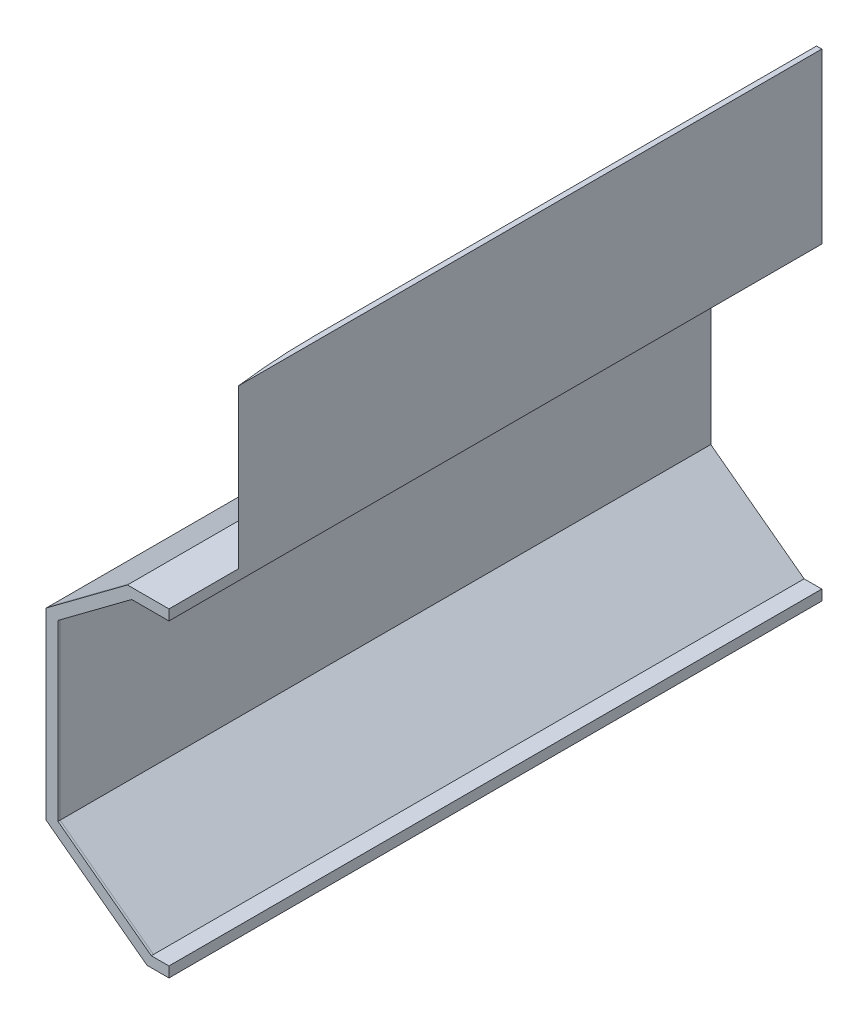
ISO-10303-21;
HEADER;
FILE_DESCRIPTION(('STEP AP214'),'2;1');
FILE_NAME('part.step','',(''),(''),'','','');
FILE_SCHEMA(('AUTOMOTIVE_DESIGN { 1 0 10303 214 1 1 1 1 }'));
ENDSEC;
DATA;
#1=APPLICATION_CONTEXT('core data for automotive mechanical design processes');
#2=APPLICATION_PROTOCOL_DEFINITION('international standard','automotive_design',2000,#1);
#3=PRODUCT_CONTEXT('',#1,'mechanical');
#4=PRODUCT('Part','Part','',(#3));
#5=PRODUCT_RELATED_PRODUCT_CATEGORY('part','',(#4));
#6=PRODUCT_DEFINITION_FORMATION('','',#4);
#7=PRODUCT_DEFINITION_CONTEXT('part definition',#1,'design');
#8=PRODUCT_DEFINITION('design','',#6,#7);
#9=PRODUCT_DEFINITION_SHAPE('','',#8);
#10=(LENGTH_UNIT() NAMED_UNIT(*) SI_UNIT(.MILLI.,.METRE.));
#11=(NAMED_UNIT(*) PLANE_ANGLE_UNIT() SI_UNIT($,.RADIAN.));
#12=(NAMED_UNIT(*) SI_UNIT($,.STERADIAN.) SOLID_ANGLE_UNIT());
#13=UNCERTAINTY_MEASURE_WITH_UNIT(LENGTH_MEASURE(1.E-05),#10,'distance_accuracy_value','');
#14=(GEOMETRIC_REPRESENTATION_CONTEXT(3) GLOBAL_UNCERTAINTY_ASSIGNED_CONTEXT((#13)) GLOBAL_UNIT_ASSIGNED_CONTEXT((#10,
#11,#12)) REPRESENTATION_CONTEXT('',''));
#15=CARTESIAN_POINT('',(0.,0.,0.));
#16=DIRECTION('',(0.,0.,1.));
#17=DIRECTION('',(1.,0.,0.));
#18=AXIS2_PLACEMENT_3D('',#15,#16,#17);
#19=CARTESIAN_POINT('',(1.66533453693773E-13,0.,0.));
#20=DIRECTION('',(0.,0.,1.));
#21=DIRECTION('',(1.,0.,0.));
#22=AXIS2_PLACEMENT_3D('',#19,#20,#21);
#23=PLANE('',#22);
#24=DIRECTION('',(0.801587665382146,0.597877257225261,0.));
#25=VECTOR('',#24,1.);
#26=CARTESIAN_POINT('',(-325.506364446809,65.1189106132931,0.));
#27=LINE('',#26,#25);
#28=CARTESIAN_POINT('',(-325.506364446809,65.1189106132931,0.));
#29=VERTEX_POINT('',#28);
#30=CARTESIAN_POINT('',(-308.554799780113,77.7625120885841,0.));
#31=VERTEX_POINT('',#30);
#32=EDGE_CURVE('E512',#29,#31,#27,.T.);
#33=ORIENTED_EDGE('',*,*,#32,.F.);
#34=DIRECTION('',(0.,1.,0.));
#35=VECTOR('',#34,1.);
#36=CARTESIAN_POINT('',(-325.506364446809,25.118910613293,0.));
#37=LINE('',#36,#35);
#38=CARTESIAN_POINT('',(-325.506364446809,25.118910613293,0.));
#39=VERTEX_POINT('',#38);
#40=EDGE_CURVE('E332',#39,#29,#37,.T.);
#41=ORIENTED_EDGE('',*,*,#40,.F.);
#42=DIRECTION('',(-0.801587665382151,0.597877257225255,0.));
#43=VECTOR('',#42,1.);
#44=CARTESIAN_POINT('',(-304.054799780113,9.11891061329305,0.));
#45=LINE('',#44,#43);
#46=CARTESIAN_POINT('',(-304.054799780113,9.11891061329305,0.));
#47=VERTEX_POINT('',#46);
#48=EDGE_CURVE('E515',#47,#39,#45,.T.);
#49=ORIENTED_EDGE('',*,*,#48,.F.);
#50=DIRECTION('',(-1.,0.,0.));
#51=VECTOR('',#50,1.);
#52=CARTESIAN_POINT('',(-304.054799780113,9.11891061329305,0.));
#53=LINE('',#52,#51);
#54=CARTESIAN_POINT('',(-300.,9.11891061329304,0.));
#55=VERTEX_POINT('',#54);
#56=EDGE_CURVE('E509',#55,#47,#53,.T.);
#57=ORIENTED_EDGE('',*,*,#56,.F.);
#58=DIRECTION('',(0.,-1.,0.));
#59=VECTOR('',#58,1.);
#60=CARTESIAN_POINT('',(-300.,0.,0.));
#61=LINE('',#60,#59);
#62=CARTESIAN_POINT('',(-300.,6.71891061329304,0.));
#63=VERTEX_POINT('',#62);
#64=EDGE_CURVE('E214',#55,#63,#61,.T.);
#65=ORIENTED_EDGE('',*,*,#64,.T.);
#66=DIRECTION('',(-1.,0.,0.));
#67=VECTOR('',#66,1.);
#68=CARTESIAN_POINT('',(-262.506364446809,6.71891061329304,0.));
#69=LINE('',#68,#67);
#70=CARTESIAN_POINT('',(-305.037519412632,6.71891061329305,0.));
#71=VERTEX_POINT('',#70);
#72=EDGE_CURVE('E399',#63,#71,#69,.T.);
#73=ORIENTED_EDGE('',*,*,#72,.T.);
#74=DIRECTION('',(-0.801587665382151,0.597877257225255,0.));
#75=VECTOR('',#74,1.);
#76=CARTESIAN_POINT('',(-305.790326326267,7.28040394980749,0.));
#77=LINE('',#76,#75);
#78=CARTESIAN_POINT('',(-328.206364446809,23.9997722337211,0.));
#79=VERTEX_POINT('',#78);
#80=EDGE_CURVE('E209',#71,#79,#77,.T.);
#81=ORIENTED_EDGE('',*,*,#80,.T.);
#82=DIRECTION('',(0.,1.,0.));
#83=VECTOR('',#82,1.);
#84=CARTESIAN_POINT('',(-328.206364446809,25.118910613293,0.));
#85=LINE('',#84,#83);
#86=CARTESIAN_POINT('',(-328.206364446809,66.238048992865,0.));
#87=VERTEX_POINT('',#86);
#88=EDGE_CURVE('E205',#79,#87,#85,.T.);
#89=ORIENTED_EDGE('',*,*,#88,.T.);
#90=DIRECTION('',(0.801587665382146,0.597877257225261,0.));
#91=VECTOR('',#90,1.);
#92=CARTESIAN_POINT('',(-327.241890992963,66.9574172767786,0.));
#93=LINE('',#92,#91);
#94=CARTESIAN_POINT('',(-309.537519412632,80.1625120885842,0.));
#95=VERTEX_POINT('',#94);
#96=EDGE_CURVE('E300',#87,#95,#93,.T.);
#97=ORIENTED_EDGE('',*,*,#96,.T.);
#98=DIRECTION('',(1.,0.,0.));
#99=VECTOR('',#98,1.);
#100=CARTESIAN_POINT('',(-262.506364446809,80.1625120885842,0.));
#101=LINE('',#100,#99);
#102=CARTESIAN_POINT('',(-301.206364446809,80.1625120885842,0.));
#103=VERTEX_POINT('',#102);
#104=EDGE_CURVE('E204',#95,#103,#101,.T.);
#105=ORIENTED_EDGE('',*,*,#104,.T.);
#106=DIRECTION('',(0.,-1.,0.));
#107=VECTOR('',#106,1.);
#108=CARTESIAN_POINT('',(-301.206364446809,329.118910613293,0.));
#109=LINE('',#108,#107);
#110=CARTESIAN_POINT('',(-301.206364446809,116.56754481445,0.));
#111=VERTEX_POINT('',#110);
#112=EDGE_CURVE('E331',#111,#103,#109,.T.);
#113=ORIENTED_EDGE('',*,*,#112,.F.);
#114=DIRECTION('',(-1.,0.,0.));
#115=VECTOR('',#114,1.);
#116=CARTESIAN_POINT('',(-253.506364446809,116.56754481445,0.));
#117=LINE('',#116,#115);
#118=CARTESIAN_POINT('',(-300.,116.56754481445,0.));
#119=VERTEX_POINT('',#118);
#120=EDGE_CURVE('E226',#119,#111,#117,.T.);
#121=ORIENTED_EDGE('',*,*,#120,.F.);
#122=CARTESIAN_POINT('',(-300.,77.7625120885841,0.));
#123=VERTEX_POINT('',#122);
#124=EDGE_CURVE('E202',#119,#123,#61,.T.);
#125=ORIENTED_EDGE('',*,*,#124,.T.);
#126=DIRECTION('',(1.,0.,0.));
#127=VECTOR('',#126,1.);
#128=CARTESIAN_POINT('',(-308.554799780113,77.7625120885841,0.));
#129=LINE('',#128,#127);
#130=EDGE_CURVE('E527',#31,#123,#129,.T.);
#131=ORIENTED_EDGE('',*,*,#130,.F.);
#132=EDGE_LOOP('',(#33,#41,#49,#57,#65,#73,#81,#89,#97,#105,#113,#121,#125,#131));
#133=FACE_BOUND('',#132,.T.);
#134=ADVANCED_FACE('F34',(#133),#23,.F.);
#135=CARTESIAN_POINT('',(-308.554799780113,77.7625120885841,-149.499973367811));
#136=DIRECTION('',(0.,1.,0.));
#137=DIRECTION('',(-1.,0.,0.));
#138=AXIS2_PLACEMENT_3D('',#135,#136,#137);
#139=PLANE('',#138);
#140=DIRECTION('',(1.,0.,0.));
#141=VECTOR('',#140,1.);
#142=CARTESIAN_POINT('',(-308.554799780113,77.7625120885841,150.));
#143=LINE('',#142,#141);
#144=CARTESIAN_POINT('',(-308.553137339858,77.7625120885842,150.));
#145=VERTEX_POINT('',#144);
#146=CARTESIAN_POINT('',(-300.,77.7625120885841,149.999999999977));
#147=VERTEX_POINT('',#146);
#148=EDGE_CURVE('E223',#145,#147,#143,.T.);
#149=ORIENTED_EDGE('',*,*,#148,.F.);
#150=CARTESIAN_POINT('',(-308.554799780113,77.7625120885841,149.500026632189));
#151=CARTESIAN_POINT('',(-308.554799780113,77.7625120885841,183.967505772208));
#152=CARTESIAN_POINT('',(-289.480913338998,77.7625120885841,208.339694002522));
#153=CARTESIAN_POINT('',(-262.506364446809,77.7625120885841,208.339694002522));
#154=(BOUNDED_CURVE() B_SPLINE_CURVE(3,(#150,#151,#152,#153),.UNSPECIFIED.,.F.,
.F.) B_SPLINE_CURVE_WITH_KNOTS((4,4),(0.,1.),
.UNSPECIFIED.) CURVE() GEOMETRIC_REPRESENTATION_ITEM() RATIONAL_B_SPLINE_CURVE((1.,
0.804737854124365,0.804737854124365,1.)) REPRESENTATION_ITEM(''));
#155=CARTESIAN_POINT('',(-308.554799780113,77.7625120885841,149.500026632189));
#156=VERTEX_POINT('',#155);
#157=EDGE_CURVE('E102',#156,#145,#154,.T.);
#158=ORIENTED_EDGE('',*,*,#157,.F.);
#159=DIRECTION('',(0.,0.,1.));
#160=VECTOR('',#159,1.);
#161=CARTESIAN_POINT('',(-308.554799780113,77.7625120885841,-149.499973367811));
#162=LINE('',#161,#160);
#163=EDGE_CURVE('E405',#31,#156,#162,.T.);
#164=ORIENTED_EDGE('',*,*,#163,.F.);
#165=ORIENTED_EDGE('',*,*,#130,.T.);
#166=DIRECTION('',(0.,0.,-1.));
#167=VECTOR('',#166,1.);
#168=CARTESIAN_POINT('',(-300.,77.7625120885841,-149.499973367811));
#169=LINE('',#168,#167);
#170=EDGE_CURVE('E221',#147,#123,#169,.T.);
#171=ORIENTED_EDGE('',*,*,#170,.F.);
#172=EDGE_LOOP('',(#149,#158,#164,#165,#171));
#173=FACE_BOUND('',#172,.T.);
#174=ADVANCED_FACE('F283',(#173),#139,.F.);
#175=CARTESIAN_POINT('',(-304.054799780113,9.11891061329305,-149.499973367811));
#176=DIRECTION('',(-0.597877257225255,-0.80158766538215,0.));
#177=DIRECTION('',(0.801587665382151,-0.597877257225255,0.));
#178=AXIS2_PLACEMENT_3D('',#175,#176,#177);
#179=PLANE('',#178);
#180=DIRECTION('',(0.,0.,1.));
#181=VECTOR('',#180,1.);
#182=CARTESIAN_POINT('',(-304.054799780113,9.11891061329305,-149.499973367811));
#183=LINE('',#182,#181);
#184=CARTESIAN_POINT('',(-304.054799780113,9.11891061329304,149.500026632189));
#185=VERTEX_POINT('',#184);
#186=EDGE_CURVE('E231',#47,#185,#183,.T.);
#187=ORIENTED_EDGE('',*,*,#186,.F.);
#188=ORIENTED_EDGE('',*,*,#48,.T.);
#189=DIRECTION('',(0.,0.,1.));
#190=VECTOR('',#189,1.);
#191=CARTESIAN_POINT('',(-325.506364446809,25.118910613293,-149.499973367811));
#192=LINE('',#191,#190);
#193=CARTESIAN_POINT('',(-325.506364446809,25.118910613293,149.500026632189));
#194=VERTEX_POINT('',#193);
#195=EDGE_CURVE('E414',#39,#194,#192,.T.);
#196=ORIENTED_EDGE('',*,*,#195,.T.);
#197=DIRECTION('',(0.801587665382151,-0.597877257225255,0.));
#198=VECTOR('',#197,1.);
#199=CARTESIAN_POINT('',(-304.054799780113,9.11891061329304,149.500026632189));
#200=LINE('',#199,#198);
#201=EDGE_CURVE('E417',#194,#185,#200,.T.);
#202=ORIENTED_EDGE('',*,*,#201,.T.);
#203=EDGE_LOOP('',(#187,#188,#196,#202));
#204=FACE_BOUND('',#203,.T.);
#205=ADVANCED_FACE('F380',(#204),#179,.F.);
#206=CARTESIAN_POINT('',(-304.054799780113,9.11891061329305,-149.499973367811));
#207=DIRECTION('',(0.,-1.,0.));
#208=DIRECTION('',(1.,0.,0.));
#209=AXIS2_PLACEMENT_3D('',#206,#207,#208);
#210=PLANE('',#209);
#211=DIRECTION('',(-1.,0.,0.));
#212=VECTOR('',#211,1.);
#213=CARTESIAN_POINT('',(-304.054799780113,9.11891061329304,150.));
#214=LINE('',#213,#212);
#215=CARTESIAN_POINT('',(-300.,9.11891061329304,149.999999999977));
#216=VERTEX_POINT('',#215);
#217=CARTESIAN_POINT('',(-304.052957277802,9.11891061329304,150.));
#218=VERTEX_POINT('',#217);
#219=EDGE_CURVE('E395',#216,#218,#214,.T.);
#220=ORIENTED_EDGE('',*,*,#219,.F.);
#221=DIRECTION('',(0.,0.,1.));
#222=VECTOR('',#221,1.);
#223=CARTESIAN_POINT('',(-300.,9.11891061329304,-149.499973367811));
#224=LINE('',#223,#222);
#225=EDGE_CURVE('E400',#55,#216,#224,.T.);
#226=ORIENTED_EDGE('',*,*,#225,.F.);
#227=ORIENTED_EDGE('',*,*,#56,.T.);
#228=ORIENTED_EDGE('',*,*,#186,.T.);
#229=CARTESIAN_POINT('',(-304.054799780113,9.11891061329304,149.500026632189));
#230=CARTESIAN_POINT('',(-304.054799780113,9.11891061329305,180.599233755854));
#231=CARTESIAN_POINT('',(-286.844874369677,9.11891061329305,202.589694002522));
#232=CARTESIAN_POINT('',(-262.506364446809,9.11891061329305,202.589694002522));
#233=(BOUNDED_CURVE() B_SPLINE_CURVE(3,(#229,#230,#231,#232),.UNSPECIFIED.,.F.,
.F.) B_SPLINE_CURVE_WITH_KNOTS((4,4),(0.,1.),
.UNSPECIFIED.) CURVE() GEOMETRIC_REPRESENTATION_ITEM() RATIONAL_B_SPLINE_CURVE((1.,
0.804737854124365,0.804737854124365,1.)) REPRESENTATION_ITEM(''));
#234=EDGE_CURVE('E108',#185,#218,#233,.T.);
#235=ORIENTED_EDGE('',*,*,#234,.T.);
#236=EDGE_LOOP('',(#220,#226,#227,#228,#235));
#237=FACE_BOUND('',#236,.T.);
#238=ADVANCED_FACE('F282',(#237),#210,.F.);
#239=CARTESIAN_POINT('',(-325.506364446809,25.118910613293,-149.499973367811));
#240=DIRECTION('',(-1.,0.,0.));
#241=DIRECTION('',(0.,-1.,0.));
#242=AXIS2_PLACEMENT_3D('',#239,#240,#241);
#243=PLANE('',#242);
#244=ORIENTED_EDGE('',*,*,#195,.F.);
#245=ORIENTED_EDGE('',*,*,#40,.T.);
#246=DIRECTION('',(0.,0.,1.));
#247=VECTOR('',#246,1.);
#248=CARTESIAN_POINT('',(-325.506364446809,65.1189106132931,-149.499973367811));
#249=LINE('',#248,#247);
#250=CARTESIAN_POINT('',(-325.506364446809,65.1189106132931,149.500026632189));
#251=VERTEX_POINT('',#250);
#252=EDGE_CURVE('E410',#29,#251,#249,.T.);
#253=ORIENTED_EDGE('',*,*,#252,.T.);
#254=DIRECTION('',(0.,-1.,0.));
#255=VECTOR('',#254,1.);
#256=CARTESIAN_POINT('',(-325.506364446809,25.118910613293,149.500026632189));
#257=LINE('',#256,#255);
#258=EDGE_CURVE('E413',#251,#194,#257,.T.);
#259=ORIENTED_EDGE('',*,*,#258,.T.);
#260=EDGE_LOOP('',(#244,#245,#253,#259));
#261=FACE_BOUND('',#260,.T.);
#262=ADVANCED_FACE('F385',(#261),#243,.F.);
#263=CARTESIAN_POINT('',(-262.506364446809,25.1189106132931,230.000026632189));
#264=CARTESIAN_POINT('',(-136.506364446809,25.1189106132931,230.000026632189));
#265=CARTESIAN_POINT('',(-136.506364446809,25.1189106132931,69.0000266321888));
#266=CARTESIAN_POINT('',(-262.506364446809,25.1189106132931,69.0000266321888));
#267=CARTESIAN_POINT('',(-388.506364446809,25.1189106132931,69.0000266321888));
#268=CARTESIAN_POINT('',(-388.506364446809,25.1189106132931,230.000026632189));
#269=CARTESIAN_POINT('',(-262.506364446809,25.1189106132931,230.000026632189));
#270=CARTESIAN_POINT('',(-262.506364446809,9.11891061329304,202.589694002522));
#271=CARTESIAN_POINT('',(-179.409493780201,9.11891061329304,202.589694002522));
#272=CARTESIAN_POINT('',(-179.409493780201,9.11891061329304,96.410359261856));
#273=CARTESIAN_POINT('',(-262.506364446809,9.11891061329304,96.410359261856));
#274=CARTESIAN_POINT('',(-345.603235113417,9.11891061329305,96.410359261856));
#275=CARTESIAN_POINT('',(-345.603235113417,9.11891061329305,202.589694002522));
#276=CARTESIAN_POINT('',(-262.506364446809,9.11891061329304,202.589694002522));
#277=(BOUNDED_SURFACE() B_SPLINE_SURFACE(1,3,((#263,#264,#265,#266,#267,#268,#269),(#270,#271,
#272,#273,#274,#275,#276)),.UNSPECIFIED.,.F.,.T.,.F.) B_SPLINE_SURFACE_WITH_KNOTS((2,2),(4,3,4),
(0.,1.),(0.,0.5,1.),
.UNSPECIFIED.) GEOMETRIC_REPRESENTATION_ITEM() RATIONAL_B_SPLINE_SURFACE(((1.,0.333333333333333,
0.333333333333333,1.,0.333333333333333,0.333333333333333,1.),(1.,0.333333333333333,
0.333333333333333,1.,0.333333333333333,0.333333333333333,1.))) REPRESENTATION_ITEM('') SURFACE());
#278=CARTESIAN_POINT('',(-304.052957277802,9.11891061329304,150.));
#279=CARTESIAN_POINT('',(-307.628340813314,11.7855528874402,150.));
#280=CARTESIAN_POINT('',(-311.20371239795,14.4522111849503,150.));
#281=CARTESIAN_POINT('',(-316.566758271069,18.4522140552676,150.));
#282=CARTESIAN_POINT('',(-318.354438311504,19.7855509160752,150.));
#283=CARTESIAN_POINT('',(-321.929795628149,22.4522283438555,150.));
#284=CARTESIAN_POINT('',(-323.717472904358,23.7855689108282,150.));
#285=CARTESIAN_POINT('',(-325.505149333651,25.1189106132931,150.));
#286=B_SPLINE_CURVE_WITH_KNOTS('',3,(#278,#279,#280,#281,#282,#283,#284,#285),.UNSPECIFIED.,.F.,
.F.,(4,2,2,4),(0.,13.3809243325822,20.0713864991394,26.7618486657284),.UNSPECIFIED.);
#287=CARTESIAN_POINT('',(-325.505149333651,25.118910613293,150.));
#288=VERTEX_POINT('',#287);
#289=EDGE_CURVE('E212',#218,#288,#286,.T.);
#290=CARTESIAN_POINT('',(-325.506364446809,25.118910613293,149.500026632189));
#291=CARTESIAN_POINT('',(-325.506364446809,25.118910613293,196.655834861155));
#292=CARTESIAN_POINT('',(-299.410910017304,25.118910613293,230.000026632189));
#293=CARTESIAN_POINT('',(-262.506364446809,25.118910613293,230.000026632189));
#294=(BOUNDED_CURVE() B_SPLINE_CURVE(3,(#290,#291,#292,#293),.UNSPECIFIED.,.F.,
.F.) B_SPLINE_CURVE_WITH_KNOTS((4,4),(0.,1.),
.UNSPECIFIED.) CURVE() GEOMETRIC_REPRESENTATION_ITEM() RATIONAL_B_SPLINE_CURVE((1.,
0.804737854124365,0.804737854124365,1.)) REPRESENTATION_ITEM(''));
#295=EDGE_CURVE('E114',#194,#288,#294,.T.);
#296=ORIENTED_EDGE('',*,*,#289,.F.);
#297=ORIENTED_EDGE('',*,*,#234,.F.);
#298=ORIENTED_EDGE('',*,*,#201,.F.);
#299=ORIENTED_EDGE('',*,*,#295,.T.);
#300=EDGE_LOOP('',(#296,#297,#298,#299));
#301=FACE_BOUND('',#300,.T.);
#302=ADVANCED_FACE('F270',(#301),#277,.F.);
#303=CARTESIAN_POINT('',(-262.506364446809,9.11891061329304,230.000026632189));
#304=CARTESIAN_POINT('',(-136.506364446809,9.11891061329304,230.000026632189));
#305=CARTESIAN_POINT('',(-136.506364446809,9.11891061329303,69.0000266321889));
#306=CARTESIAN_POINT('',(-262.506364446809,9.11891061329304,69.0000266321888));
#307=CARTESIAN_POINT('',(-388.506364446809,9.11891061329305,69.0000266321888));
#308=CARTESIAN_POINT('',(-388.506364446809,9.11891061329305,230.000026632189));
#309=CARTESIAN_POINT('',(-262.506364446809,9.11891061329304,230.000026632189));
#310=(BOUNDED_CURVE() B_SPLINE_CURVE(3,(#303,#304,#305,#306,#307,#308,#309),.UNSPECIFIED.,.T.,
.F.) B_SPLINE_CURVE_WITH_KNOTS((4,3,4),(0.,0.5,1.),
.UNSPECIFIED.) CURVE() GEOMETRIC_REPRESENTATION_ITEM() RATIONAL_B_SPLINE_CURVE((1.,
0.333333333333333,0.333333333333333,1.,0.333333333333333,0.333333333333333,1.)) REPRESENTATION_ITEM(''));
#311=DIRECTION('',(0.,1.,0.));
#312=VECTOR('',#311,1.);
#313=SURFACE_OF_LINEAR_EXTRUSION('',#310,#312);
#314=DIRECTION('',(0.,1.,0.));
#315=VECTOR('',#314,1.);
#316=CARTESIAN_POINT('',(-325.505149333651,45.1189106132931,150.));
#317=LINE('',#316,#315);
#318=CARTESIAN_POINT('',(-325.505149333651,65.118910613293,150.));
#319=VERTEX_POINT('',#318);
#320=EDGE_CURVE('E393',#288,#319,#317,.T.);
#321=ORIENTED_EDGE('',*,*,#320,.F.);
#322=ORIENTED_EDGE('',*,*,#295,.F.);
#323=ORIENTED_EDGE('',*,*,#258,.F.);
#324=CARTESIAN_POINT('',(-325.506364446809,65.1189106132931,149.500026632189));
#325=CARTESIAN_POINT('',(-325.506364446809,65.1189106132931,196.655834861155));
#326=CARTESIAN_POINT('',(-299.410910017304,65.1189106132931,230.000026632189));
#327=CARTESIAN_POINT('',(-262.506364446809,65.1189106132931,230.000026632189));
#328=(BOUNDED_CURVE() B_SPLINE_CURVE(3,(#324,#325,#326,#327),.UNSPECIFIED.,.F.,
.F.) B_SPLINE_CURVE_WITH_KNOTS((4,4),(0.,1.),
.UNSPECIFIED.) CURVE() GEOMETRIC_REPRESENTATION_ITEM() RATIONAL_B_SPLINE_CURVE((1.,
0.804737854124365,0.804737854124365,1.)) REPRESENTATION_ITEM(''));
#329=EDGE_CURVE('E95',#251,#319,#328,.T.);
#330=ORIENTED_EDGE('',*,*,#329,.T.);
#331=EDGE_LOOP('',(#321,#322,#323,#330));
#332=FACE_BOUND('',#331,.T.);
#333=ADVANCED_FACE('F265',(#332),#313,.F.);
#334=CARTESIAN_POINT('',(-262.506364446809,65.1189106132931,69.0000266321888));
#335=CARTESIAN_POINT('',(-136.506364446809,65.1189106132931,69.0000266321888));
#336=CARTESIAN_POINT('',(-136.506364446809,65.1189106132931,230.000026632189));
#337=CARTESIAN_POINT('',(-262.506364446809,65.1189106132931,230.000026632189));
#338=CARTESIAN_POINT('',(-388.506364446809,65.1189106132931,230.000026632189));
#339=CARTESIAN_POINT('',(-388.506364446809,65.1189106132931,69.0000266321888));
#340=CARTESIAN_POINT('',(-262.506364446809,65.1189106132931,69.0000266321888));
#341=CARTESIAN_POINT('',(-262.506364446809,77.7625120885841,90.6603592618559));
#342=CARTESIAN_POINT('',(-170.409493780201,77.7625120885841,90.6603592618559));
#343=CARTESIAN_POINT('',(-170.409493780201,77.7625120885841,208.339694002522));
#344=CARTESIAN_POINT('',(-262.506364446809,77.7625120885841,208.339694002522));
#345=CARTESIAN_POINT('',(-354.603235113417,77.7625120885841,208.339694002522));
#346=CARTESIAN_POINT('',(-354.603235113417,77.7625120885841,90.6603592618559));
#347=CARTESIAN_POINT('',(-262.506364446809,77.7625120885841,90.6603592618559));
#348=(BOUNDED_SURFACE() B_SPLINE_SURFACE(1,3,((#334,#335,#336,#337,#338,#339,#340),(#341,#342,
#343,#344,#345,#346,#347)),.UNSPECIFIED.,.F.,.T.,.F.) B_SPLINE_SURFACE_WITH_KNOTS((2,2),(4,3,4),
(0.,1.),(0.,0.5,1.),
.UNSPECIFIED.) GEOMETRIC_REPRESENTATION_ITEM() RATIONAL_B_SPLINE_SURFACE(((1.,0.333333333333333,
0.333333333333333,1.,0.333333333333333,0.333333333333333,1.),(1.,0.333333333333333,
0.333333333333333,1.,0.333333333333333,0.333333333333333,1.))) REPRESENTATION_ITEM('') SURFACE());
#349=CARTESIAN_POINT('',(-325.505149333651,65.1189106132931,150.));
#350=CARTESIAN_POINT('',(-324.092485212729,66.1725488228257,150.));
#351=CARTESIAN_POINT('',(-322.67982050428,67.226186244635,150.));
#352=CARTESIAN_POINT('',(-319.854489464162,69.3334589119173,150.));
#353=CARTESIAN_POINT('',(-318.441823132493,70.3870941573903,150.));
#354=CARTESIAN_POINT('',(-314.203821030365,73.5479957280012,150.));
#355=CARTESIAN_POINT('',(-311.378482152828,75.6552578872993,150.));
#356=CARTESIAN_POINT('',(-308.553137339858,77.7625120885841,150.));
#357=B_SPLINE_CURVE_WITH_KNOTS('',3,(#349,#350,#351,#352,#353,#354,#355,#356),.UNSPECIFIED.,.F.,
.F.,(4,2,2,4),(0.,5.28696137267602,10.5739227453527,21.1478454908659),.UNSPECIFIED.);
#358=EDGE_CURVE('E291',#319,#145,#357,.T.);
#359=DIRECTION('',(-0.801587665382146,-0.597877257225261,0.));
#360=VECTOR('',#359,1.);
#361=CARTESIAN_POINT('',(-325.506364446809,65.1189106132931,149.500026632189));
#362=LINE('',#361,#360);
#363=EDGE_CURVE('E408',#156,#251,#362,.T.);
#364=ORIENTED_EDGE('',*,*,#358,.F.);
#365=ORIENTED_EDGE('',*,*,#329,.F.);
#366=ORIENTED_EDGE('',*,*,#363,.F.);
#367=ORIENTED_EDGE('',*,*,#157,.T.);
#368=EDGE_LOOP('',(#364,#365,#366,#367));
#369=FACE_BOUND('',#368,.T.);
#370=ADVANCED_FACE('F269',(#369),#348,.F.);
#371=CARTESIAN_POINT('',(-325.506364446809,65.1189106132931,-149.499973367811));
#372=DIRECTION('',(-0.597877257225261,0.801587665382146,0.));
#373=DIRECTION('',(-0.801587665382146,-0.597877257225261,0.));
#374=AXIS2_PLACEMENT_3D('',#371,#372,#373);
#375=PLANE('',#374);
#376=ORIENTED_EDGE('',*,*,#252,.F.);
#377=ORIENTED_EDGE('',*,*,#32,.T.);
#378=ORIENTED_EDGE('',*,*,#163,.T.);
#379=ORIENTED_EDGE('',*,*,#363,.T.);
#380=EDGE_LOOP('',(#376,#377,#378,#379));
#381=FACE_BOUND('',#380,.T.);
#382=ADVANCED_FACE('F281',(#381),#375,.F.);
#383=CARTESIAN_POINT('',(-300.,0.,0.));
#384=DIRECTION('',(1.,0.,0.));
#385=DIRECTION('',(0.,0.,-1.));
#386=AXIS2_PLACEMENT_3D('',#383,#384,#385);
#387=PLANE('',#386);
#388=DIRECTION('',(0.,-1.,0.));
#389=VECTOR('',#388,1.);
#390=CARTESIAN_POINT('',(-300.,0.,150.));
#391=LINE('',#390,#389);
#392=CARTESIAN_POINT('',(-300.,80.1625120885842,149.999999999977));
#393=VERTEX_POINT('',#392);
#394=EDGE_CURVE('E502',#393,#147,#391,.T.);
#395=ORIENTED_EDGE('',*,*,#394,.T.);
#396=ORIENTED_EDGE('',*,*,#170,.T.);
#397=ORIENTED_EDGE('',*,*,#124,.F.);
#398=DIRECTION('',(0.,0.,1.));
#399=VECTOR('',#398,1.);
#400=CARTESIAN_POINT('',(-300.,116.56754481445,230.000026632189));
#401=LINE('',#400,#399);
#402=CARTESIAN_POINT('',(-300.,116.56754481445,134.047260122252));
#403=VERTEX_POINT('',#402);
#404=EDGE_CURVE('E191',#119,#403,#401,.T.);
#405=ORIENTED_EDGE('',*,*,#404,.T.);
#406=DIRECTION('',(0.,-1.,0.));
#407=VECTOR('',#406,1.);
#408=CARTESIAN_POINT('',(-300.,103.299199319842,134.047260122252));
#409=LINE('',#408,#407);
#410=CARTESIAN_POINT('',(-300.,80.1625120885842,134.047260122252));
#411=VERTEX_POINT('',#410);
#412=EDGE_CURVE('E199',#403,#411,#409,.T.);
#413=ORIENTED_EDGE('',*,*,#412,.T.);
#414=DIRECTION('',(0.,0.,-1.));
#415=VECTOR('',#414,1.);
#416=CARTESIAN_POINT('',(-300.,80.1625120885842,-208.339640738144));
#417=LINE('',#416,#415);
#418=EDGE_CURVE('E224',#393,#411,#417,.T.);
#419=ORIENTED_EDGE('',*,*,#418,.F.);
#420=EDGE_LOOP('',(#395,#396,#397,#405,#413,#419));
#421=FACE_BOUND('',#420,.T.);
#422=ADVANCED_FACE('F197',(#421),#387,.T.);
#423=CARTESIAN_POINT('',(1.11022302462516E-13,0.,150.));
#424=DIRECTION('',(0.,0.,1.));
#425=DIRECTION('',(1.,0.,0.));
#426=AXIS2_PLACEMENT_3D('',#423,#424,#425);
#427=PLANE('',#426);
#428=ORIENTED_EDGE('',*,*,#358,.T.);
#429=ORIENTED_EDGE('',*,*,#148,.T.);
#430=ORIENTED_EDGE('',*,*,#394,.F.);
#431=DIRECTION('',(1.,0.,0.));
#432=VECTOR('',#431,1.);
#433=CARTESIAN_POINT('',(-262.506364446809,80.1625120885842,150.));
#434=LINE('',#433,#432);
#435=CARTESIAN_POINT('',(-309.53589171041,80.1625120885842,150.));
#436=VERTEX_POINT('',#435);
#437=EDGE_CURVE('E227',#436,#393,#434,.T.);
#438=ORIENTED_EDGE('',*,*,#437,.F.);
#439=CARTESIAN_POINT('',(-328.205199270713,66.2380489928651,150.));
#440=CARTESIAN_POINT('',(-326.64942750613,67.3984261000863,150.));
#441=CARTESIAN_POINT('',(-325.093655124156,68.5588023795449,150.));
#442=CARTESIAN_POINT('',(-321.982108601974,70.8795525811109,150.));
#443=CARTESIAN_POINT('',(-320.426334461767,72.0399265032183,150.));
#444=CARTESIAN_POINT('',(-315.759008618577,75.5210436808091,150.));
#445=CARTESIAN_POINT('',(-312.647453493072,77.8417823475263,150.));
#446=CARTESIAN_POINT('',(-309.53589171041,80.1625120885842,150.));
#447=B_SPLINE_CURVE_WITH_KNOTS('',3,(#439,#440,#441,#442,#443,#444,#445,#446),.UNSPECIFIED.,.F.,
.F.,(4,2,2,4),(0.,5.82255161677033,11.6451032335414,23.2902064672573),.UNSPECIFIED.);
#448=CARTESIAN_POINT('',(-328.205199270712,66.2380489928651,150.));
#449=VERTEX_POINT('',#448);
#450=EDGE_CURVE('E324',#449,#436,#447,.T.);
#451=ORIENTED_EDGE('',*,*,#450,.F.);
#452=DIRECTION('',(0.,1.,0.));
#453=VECTOR('',#452,1.);
#454=CARTESIAN_POINT('',(-328.205199270713,45.1189106132931,150.));
#455=LINE('',#454,#453);
#456=CARTESIAN_POINT('',(-328.205199270713,23.9997722337211,150.));
#457=VERTEX_POINT('',#456);
#458=EDGE_CURVE('E409',#457,#449,#455,.T.);
#459=ORIENTED_EDGE('',*,*,#458,.F.);
#460=CARTESIAN_POINT('',(-305.035719484775,6.71891061329303,150.));
#461=CARTESIAN_POINT('',(-308.897318770376,9.59902831129326,150.));
#462=CARTESIAN_POINT('',(-312.758905264488,12.479163159687,150.));
#463=CARTESIAN_POINT('',(-318.551272862821,16.7993817130521,150.));
#464=CARTESIAN_POINT('',(-320.482060038497,18.2394572776638,150.));
#465=CARTESIAN_POINT('',(-324.343631516274,21.1196122596548,150.));
#466=CARTESIAN_POINT('',(-326.274415818376,22.559691677034,150.));
#467=CARTESIAN_POINT('',(-328.205199270712,23.9997722337211,150.));
#468=B_SPLINE_CURVE_WITH_KNOTS('',3,(#460,#461,#462,#463,#464,#465,#466,#467),.UNSPECIFIED.,.F.,
.F.,(4,2,2,4),(0.,14.4521016799317,21.6781525201759,28.9042033604519),.UNSPECIFIED.);
#469=CARTESIAN_POINT('',(-305.035719484775,6.71891061329305,150.));
#470=VERTEX_POINT('',#469);
#471=EDGE_CURVE('E316',#470,#457,#468,.T.);
#472=ORIENTED_EDGE('',*,*,#471,.F.);
#473=DIRECTION('',(-1.,0.,0.));
#474=VECTOR('',#473,1.);
#475=CARTESIAN_POINT('',(-262.506364446809,6.71891061329304,150.));
#476=LINE('',#475,#474);
#477=CARTESIAN_POINT('',(-300.,6.71891061329304,149.999999999977));
#478=VERTEX_POINT('',#477);
#479=EDGE_CURVE('E333',#478,#470,#476,.T.);
#480=ORIENTED_EDGE('',*,*,#479,.F.);
#481=EDGE_CURVE('E39',#216,#478,#391,.T.);
#482=ORIENTED_EDGE('',*,*,#481,.F.);
#483=ORIENTED_EDGE('',*,*,#219,.T.);
#484=ORIENTED_EDGE('',*,*,#289,.T.);
#485=ORIENTED_EDGE('',*,*,#320,.T.);
#486=EDGE_LOOP('',(#428,#429,#430,#438,#451,#459,#472,#480,#482,#483,#484,#485));
#487=FACE_BOUND('',#486,.T.);
#488=ADVANCED_FACE('F303',(#487),#427,.T.);
#489=DIRECTION('',(0.,0.,1.));
#490=VECTOR('',#489,1.);
#491=CARTESIAN_POINT('',(-300.,6.71891061329304,-202.589640738144));
#492=LINE('',#491,#490);
#493=EDGE_CURVE('E508',#63,#478,#492,.T.);
#494=ORIENTED_EDGE('',*,*,#493,.F.);
#495=ORIENTED_EDGE('',*,*,#64,.F.);
#496=ORIENTED_EDGE('',*,*,#225,.T.);
#497=ORIENTED_EDGE('',*,*,#481,.T.);
#498=EDGE_LOOP('',(#494,#495,#496,#497));
#499=FACE_BOUND('',#498,.T.);
#500=ADVANCED_FACE('F307',(#499),#387,.T.);
#501=CARTESIAN_POINT('',(-327.241890992963,66.9574172767786,-149.499973367811));
#502=DIRECTION('',(-0.597877257225261,0.801587665382146,0.));
#503=DIRECTION('',(-0.801587665382146,-0.597877257225261,0.));
#504=AXIS2_PLACEMENT_3D('',#501,#502,#503);
#505=PLANE('',#504);
#506=ORIENTED_EDGE('',*,*,#96,.F.);
#507=DIRECTION('',(0.,0.,1.));
#508=VECTOR('',#507,1.);
#509=CARTESIAN_POINT('',(-328.206364446809,66.238048992865,-149.499973367811));
#510=LINE('',#509,#508);
#511=CARTESIAN_POINT('',(-328.206364446809,66.238048992865,149.500026632189));
#512=VERTEX_POINT('',#511);
#513=EDGE_CURVE('E70',#87,#512,#510,.T.);
#514=ORIENTED_EDGE('',*,*,#513,.T.);
#515=DIRECTION('',(-0.801587665382147,-0.59787725722526,0.));
#516=VECTOR('',#515,1.);
#517=CARTESIAN_POINT('',(-310.290326326267,79.6010187520697,149.500026632189));
#518=LINE('',#517,#516);
#519=CARTESIAN_POINT('',(-309.537519412632,80.1625120885842,149.500026632189));
#520=VERTEX_POINT('',#519);
#521=EDGE_CURVE('E421',#520,#512,#518,.T.);
#522=ORIENTED_EDGE('',*,*,#521,.F.);
#523=DIRECTION('',(0.,0.,1.));
#524=VECTOR('',#523,1.);
#525=CARTESIAN_POINT('',(-309.537519412632,80.1625120885842,-149.499973367811));
#526=LINE('',#525,#524);
#527=EDGE_CURVE('E419',#95,#520,#526,.T.);
#528=ORIENTED_EDGE('',*,*,#527,.F.);
#529=EDGE_LOOP('',(#506,#514,#522,#528));
#530=FACE_BOUND('',#529,.T.);
#531=ADVANCED_FACE('F489',(#530),#505,.T.);
#532=CARTESIAN_POINT('',(-305.790326326267,7.28040394980749,-149.499973367811));
#533=DIRECTION('',(-0.597877257225255,-0.80158766538215,0.));
#534=DIRECTION('',(0.801587665382151,-0.597877257225255,0.));
#535=AXIS2_PLACEMENT_3D('',#532,#533,#534);
#536=PLANE('',#535);
#537=ORIENTED_EDGE('',*,*,#80,.F.);
#538=DIRECTION('',(0.,0.,1.));
#539=VECTOR('',#538,1.);
#540=CARTESIAN_POINT('',(-305.037519412632,6.71891061329304,-149.499973367811));
#541=LINE('',#540,#539);
#542=CARTESIAN_POINT('',(-305.037519412632,6.71891061329305,149.500026632189));
#543=VERTEX_POINT('',#542);
#544=EDGE_CURVE('E426',#71,#543,#541,.T.);
#545=ORIENTED_EDGE('',*,*,#544,.T.);
#546=DIRECTION('',(-0.801587665382151,0.597877257225255,0.));
#547=VECTOR('',#546,1.);
#548=CARTESIAN_POINT('',(-327.241890992963,23.2804039498075,149.500026632189));
#549=LINE('',#548,#547);
#550=CARTESIAN_POINT('',(-328.206364446809,23.9997722337211,149.500026632189));
#551=VERTEX_POINT('',#550);
#552=EDGE_CURVE('E425',#551,#543,#549,.F.);
#553=ORIENTED_EDGE('',*,*,#552,.F.);
#554=DIRECTION('',(0.,0.,1.));
#555=VECTOR('',#554,1.);
#556=CARTESIAN_POINT('',(-328.206364446809,23.9997722337211,-149.499973367811));
#557=LINE('',#556,#555);
#558=EDGE_CURVE('E78',#79,#551,#557,.T.);
#559=ORIENTED_EDGE('',*,*,#558,.F.);
#560=EDGE_LOOP('',(#537,#545,#553,#559));
#561=FACE_BOUND('',#560,.T.);
#562=ADVANCED_FACE('F536',(#561),#536,.T.);
#563=CARTESIAN_POINT('',(-262.506364446809,6.71891061329304,-202.589640738144));
#564=DIRECTION('',(0.,-1.,0.));
#565=DIRECTION('',(0.,0.,-1.));
#566=AXIS2_PLACEMENT_3D('',#563,#564,#565);
#567=PLANE('',#566);
#568=ORIENTED_EDGE('',*,*,#493,.T.);
#569=ORIENTED_EDGE('',*,*,#479,.T.);
#570=CARTESIAN_POINT('',(-262.506364446809,6.71891061329305,203.84539131074));
#571=CARTESIAN_POINT('',(-287.420538202396,6.71891061329304,203.84539131074));
#572=CARTESIAN_POINT('',(-305.037519412632,6.71891061329304,181.334804208772));
#573=CARTESIAN_POINT('',(-305.037519412632,6.71891061329305,149.500026632189));
#574=(BOUNDED_CURVE() B_SPLINE_CURVE(3,(#570,#571,#572,#573),.UNSPECIFIED.,.F.,
.F.) B_SPLINE_CURVE_WITH_KNOTS((4,4),(0.,1.),
.UNSPECIFIED.) CURVE() GEOMETRIC_REPRESENTATION_ITEM() RATIONAL_B_SPLINE_CURVE((1.,
0.804737854124365,0.804737854124365,1.)) REPRESENTATION_ITEM(''));
#575=EDGE_CURVE('E216',#543,#470,#574,.F.);
#576=ORIENTED_EDGE('',*,*,#575,.F.);
#577=ORIENTED_EDGE('',*,*,#544,.F.);
#578=ORIENTED_EDGE('',*,*,#72,.F.);
#579=EDGE_LOOP('',(#568,#569,#576,#577,#578));
#580=FACE_BOUND('',#579,.T.);
#581=ADVANCED_FACE('F309',(#580),#567,.T.);
#582=CARTESIAN_POINT('',(-328.206364446809,25.118910613293,-149.499973367811));
#583=DIRECTION('',(-1.,0.,0.));
#584=DIRECTION('',(0.,-1.,0.));
#585=AXIS2_PLACEMENT_3D('',#582,#583,#584);
#586=PLANE('',#585);
#587=ORIENTED_EDGE('',*,*,#88,.F.);
#588=ORIENTED_EDGE('',*,*,#558,.T.);
#589=DIRECTION('',(0.,1.,0.));
#590=VECTOR('',#589,1.);
#591=CARTESIAN_POINT('',(-328.206364446809,9.11891061329305,149.500026632189));
#592=LINE('',#591,#590);
#593=EDGE_CURVE('E423',#512,#551,#592,.F.);
#594=ORIENTED_EDGE('',*,*,#593,.F.);
#595=ORIENTED_EDGE('',*,*,#513,.F.);
#596=EDGE_LOOP('',(#587,#588,#594,#595));
#597=FACE_BOUND('',#596,.T.);
#598=ADVANCED_FACE('F341',(#597),#586,.T.);
#599=CARTESIAN_POINT('',(-262.506364446809,66.2380489928651,65.5500266321889));
#600=CARTESIAN_POINT('',(-131.106364446809,66.238048992865,65.5500266321889));
#601=CARTESIAN_POINT('',(-131.106364446809,66.238048992865,233.450026632189));
#602=CARTESIAN_POINT('',(-262.506364446809,66.2380489928651,233.450026632189));
#603=CARTESIAN_POINT('',(-393.906364446809,66.2380489928651,233.450026632189));
#604=CARTESIAN_POINT('',(-393.906364446809,66.2380489928651,65.5500266321888));
#605=CARTESIAN_POINT('',(-262.506364446809,66.2380489928651,65.5500266321888));
#606=CARTESIAN_POINT('',(-262.506364446809,80.1625120885842,89.4046619536377));
#607=CARTESIAN_POINT('',(-168.444054515164,80.1625120885842,89.4046619536377));
#608=CARTESIAN_POINT('',(-168.444054515164,80.1625120885842,209.59539131074));
#609=CARTESIAN_POINT('',(-262.506364446809,80.1625120885842,209.59539131074));
#610=CARTESIAN_POINT('',(-356.568674378455,80.1625120885842,209.59539131074));
#611=CARTESIAN_POINT('',(-356.568674378455,80.1625120885842,89.4046619536377));
#612=CARTESIAN_POINT('',(-262.506364446809,80.1625120885842,89.4046619536377));
#613=(BOUNDED_SURFACE() B_SPLINE_SURFACE(1,3,((#599,#600,#601,#602,#603,#604,#605),(#606,#607,
#608,#609,#610,#611,#612)),.UNSPECIFIED.,.F.,.T.,.F.) B_SPLINE_SURFACE_WITH_KNOTS((2,2),(4,3,4),
(0.,1.),(0.,0.5,1.),
.UNSPECIFIED.) GEOMETRIC_REPRESENTATION_ITEM() RATIONAL_B_SPLINE_SURFACE(((1.,0.333333333333333,
0.333333333333333,1.,0.333333333333333,0.333333333333333,1.),(1.,0.333333333333333,
0.333333333333333,1.,0.333333333333333,0.333333333333333,1.))) REPRESENTATION_ITEM('') SURFACE());
#614=CARTESIAN_POINT('',(-262.506364446809,66.2380489928651,233.450026632189));
#615=CARTESIAN_POINT('',(-300.992533398897,66.238048992865,233.450026632189));
#616=CARTESIAN_POINT('',(-328.206364446809,66.238048992865,198.676798070968));
#617=CARTESIAN_POINT('',(-328.206364446809,66.2380489928651,149.500026632189));
#618=(BOUNDED_CURVE() B_SPLINE_CURVE(3,(#614,#615,#616,#617),.UNSPECIFIED.,.F.,
.F.) B_SPLINE_CURVE_WITH_KNOTS((4,4),(0.,1.),
.UNSPECIFIED.) CURVE() GEOMETRIC_REPRESENTATION_ITEM() RATIONAL_B_SPLINE_CURVE((1.,
0.804737854124365,0.804737854124365,1.)) REPRESENTATION_ITEM(''));
#619=EDGE_CURVE('E453',#512,#449,#618,.F.);
#620=CARTESIAN_POINT('',(-309.537519412632,80.1625120885842,149.500026632189));
#621=CARTESIAN_POINT('',(-309.537519412632,80.1625120885842,183.620889909717));
#622=CARTESIAN_POINT('',(-291.02830416045,80.1625120885842,208.215186124812));
#623=CARTESIAN_POINT('',(-264.345443359509,80.1625120885842,209.549428504834));
#624=(BOUNDED_CURVE() B_SPLINE_CURVE(3,(#620,#621,#622,#623),.UNSPECIFIED.,.F.,
.F.) B_SPLINE_CURVE_WITH_KNOTS((4,4),(0.,1.),
.UNSPECIFIED.) CURVE() GEOMETRIC_REPRESENTATION_ITEM() RATIONAL_B_SPLINE_CURVE((1.,
0.813866236131488,0.813866236131488,1.)) REPRESENTATION_ITEM(''));
#625=EDGE_CURVE('E428',#520,#436,#624,.T.);
#626=ORIENTED_EDGE('',*,*,#619,.T.);
#627=ORIENTED_EDGE('',*,*,#450,.T.);
#628=ORIENTED_EDGE('',*,*,#625,.F.);
#629=ORIENTED_EDGE('',*,*,#521,.T.);
#630=EDGE_LOOP('',(#626,#627,#628,#629));
#631=FACE_BOUND('',#630,.T.);
#632=ADVANCED_FACE('F335',(#631),#613,.T.);
#633=CARTESIAN_POINT('',(-262.506364446809,23.9997722337211,233.450026632189));
#634=CARTESIAN_POINT('',(-131.106364446809,23.9997722337211,233.450026632189));
#635=CARTESIAN_POINT('',(-131.106364446809,23.9997722337211,65.5500266321888));
#636=CARTESIAN_POINT('',(-262.506364446809,23.9997722337211,65.5500266321888));
#637=CARTESIAN_POINT('',(-393.906364446809,23.9997722337211,65.5500266321888));
#638=CARTESIAN_POINT('',(-393.906364446809,23.9997722337211,233.450026632189));
#639=CARTESIAN_POINT('',(-262.506364446809,23.9997722337211,233.450026632189));
#640=CARTESIAN_POINT('',(-262.506364446809,6.71891061329302,203.84539131074));
#641=CARTESIAN_POINT('',(-177.444054515164,6.718910613293,203.84539131074));
#642=CARTESIAN_POINT('',(-177.444054515164,6.71891061329301,95.1546619536376));
#643=CARTESIAN_POINT('',(-262.506364446809,6.71891061329301,95.1546619536377));
#644=CARTESIAN_POINT('',(-347.568674378455,6.71891061329302,95.1546619536376));
#645=CARTESIAN_POINT('',(-347.568674378455,6.71891061329302,203.84539131074));
#646=CARTESIAN_POINT('',(-262.506364446809,6.71891061329302,203.84539131074));
#647=(BOUNDED_SURFACE() B_SPLINE_SURFACE(1,3,((#633,#634,#635,#636,#637,#638,#639),(#640,#641,
#642,#643,#644,#645,#646)),.UNSPECIFIED.,.F.,.T.,.F.) B_SPLINE_SURFACE_WITH_KNOTS((2,2),(4,3,4),
(0.,1.),(0.,0.5,1.),
.UNSPECIFIED.) GEOMETRIC_REPRESENTATION_ITEM() RATIONAL_B_SPLINE_SURFACE(((1.,0.333333333333333,
0.333333333333333,1.,0.333333333333333,0.333333333333333,1.),(1.,0.333333333333333,
0.333333333333333,1.,0.333333333333333,0.333333333333333,1.))) REPRESENTATION_ITEM('') SURFACE());
#648=CARTESIAN_POINT('',(-328.206364446809,23.9997722337211,149.500026632189));
#649=CARTESIAN_POINT('',(-328.206364446809,23.9997722337211,198.676798070968));
#650=CARTESIAN_POINT('',(-300.992533398897,23.9997722337211,233.450026632189));
#651=CARTESIAN_POINT('',(-262.506364446809,23.9997722337211,233.450026632189));
#652=(BOUNDED_CURVE() B_SPLINE_CURVE(3,(#648,#649,#650,#651),.UNSPECIFIED.,.F.,
.F.) B_SPLINE_CURVE_WITH_KNOTS((4,4),(0.,1.),
.UNSPECIFIED.) CURVE() GEOMETRIC_REPRESENTATION_ITEM() RATIONAL_B_SPLINE_CURVE((1.,
0.804737854124365,0.804737854124365,1.)) REPRESENTATION_ITEM(''));
#653=EDGE_CURVE('E448',#551,#457,#652,.T.);
#654=ORIENTED_EDGE('',*,*,#575,.T.);
#655=ORIENTED_EDGE('',*,*,#471,.T.);
#656=ORIENTED_EDGE('',*,*,#653,.F.);
#657=ORIENTED_EDGE('',*,*,#552,.T.);
#658=EDGE_LOOP('',(#654,#655,#656,#657));
#659=FACE_BOUND('',#658,.T.);
#660=ADVANCED_FACE('F340',(#659),#647,.T.);
#661=CARTESIAN_POINT('',(-262.506364446809,9.11891061329304,233.450026632189));
#662=CARTESIAN_POINT('',(-131.106364446809,9.11891061329303,233.450026632189));
#663=CARTESIAN_POINT('',(-131.106364446809,9.11891061329303,65.5500266321889));
#664=CARTESIAN_POINT('',(-262.506364446809,9.11891061329303,65.5500266321888));
#665=CARTESIAN_POINT('',(-393.906364446809,9.11891061329306,65.5500266321888));
#666=CARTESIAN_POINT('',(-393.906364446809,9.11891061329305,233.450026632189));
#667=CARTESIAN_POINT('',(-262.506364446809,9.11891061329304,233.450026632189));
#668=(BOUNDED_CURVE() B_SPLINE_CURVE(3,(#661,#662,#663,#664,#665,#666,#667),.UNSPECIFIED.,.T.,
.F.) B_SPLINE_CURVE_WITH_KNOTS((4,3,4),(0.,0.5,1.),
.UNSPECIFIED.) CURVE() GEOMETRIC_REPRESENTATION_ITEM() RATIONAL_B_SPLINE_CURVE((1.,
0.333333333333333,0.333333333333333,1.,0.333333333333333,0.333333333333333,1.)) REPRESENTATION_ITEM(''));
#669=DIRECTION('',(0.,1.,0.));
#670=VECTOR('',#669,1.);
#671=SURFACE_OF_LINEAR_EXTRUSION('',#668,#670);
#672=ORIENTED_EDGE('',*,*,#653,.T.);
#673=ORIENTED_EDGE('',*,*,#458,.T.);
#674=ORIENTED_EDGE('',*,*,#619,.F.);
#675=ORIENTED_EDGE('',*,*,#593,.T.);
#676=EDGE_LOOP('',(#672,#673,#674,#675));
#677=FACE_BOUND('',#676,.T.);
#678=ADVANCED_FACE('F353',(#677),#671,.T.);
#679=CARTESIAN_POINT('',(-262.506364446809,80.1625120885842,-208.339640738144));
#680=DIRECTION('',(0.,1.,0.));
#681=DIRECTION('',(0.,0.,1.));
#682=AXIS2_PLACEMENT_3D('',#679,#680,#681);
#683=PLANE('',#682);
#684=ORIENTED_EDGE('',*,*,#625,.T.);
#685=ORIENTED_EDGE('',*,*,#437,.T.);
#686=ORIENTED_EDGE('',*,*,#418,.T.);
#687=CARTESIAN_POINT('',(-301.206364446809,80.1625120885842,115.000026632189));
#688=CARTESIAN_POINT('',(-301.206364446809,80.1625120885842,152.858390441393));
#689=CARTESIAN_POINT('',(-287.995393539431,80.1625120885842,186.744939138622));
#690=CARTESIAN_POINT('',(-264.345443359509,80.1625120885842,209.549428504834));
#691=(BOUNDED_CURVE() B_SPLINE_CURVE(3,(#687,#688,#689,#690),.UNSPECIFIED.,.F.,
.F.) B_SPLINE_CURVE_WITH_KNOTS((4,4),(0.,1.),
.UNSPECIFIED.) CURVE() GEOMETRIC_REPRESENTATION_ITEM() RATIONAL_B_SPLINE_CURVE((1.,
0.930058341806268,0.930058341806268,1.)) REPRESENTATION_ITEM(''));
#692=CARTESIAN_POINT('',(-301.206364446809,80.1625120885841,115.000026632189));
#693=VERTEX_POINT('',#692);
#694=EDGE_CURVE('E207',#411,#693,#691,.F.);
#695=ORIENTED_EDGE('',*,*,#694,.T.);
#696=DIRECTION('',(0.,0.,-1.));
#697=VECTOR('',#696,1.);
#698=CARTESIAN_POINT('',(-301.206364446809,80.1625120885842,-149.499973367811));
#699=LINE('',#698,#697);
#700=EDGE_CURVE('E431',#693,#103,#699,.T.);
#701=ORIENTED_EDGE('',*,*,#700,.T.);
#702=ORIENTED_EDGE('',*,*,#104,.F.);
#703=ORIENTED_EDGE('',*,*,#527,.T.);
#704=EDGE_LOOP('',(#684,#685,#686,#695,#701,#702,#703));
#705=FACE_BOUND('',#704,.T.);
#706=ADVANCED_FACE('F362',(#705),#683,.T.);
#707=CARTESIAN_POINT('',(-301.206364446809,329.118910613293,-114.999973367811));
#708=DIRECTION('',(1.,0.,0.));
#709=DIRECTION('',(0.,0.,-1.));
#710=AXIS2_PLACEMENT_3D('',#707,#708,#709);
#711=PLANE('',#710);
#712=DIRECTION('',(0.,0.,-1.));
#713=VECTOR('',#712,1.);
#714=CARTESIAN_POINT('',(-301.206364446809,116.56754481445,-114.999973367811));
#715=LINE('',#714,#713);
#716=CARTESIAN_POINT('',(-301.206364446809,116.56754481445,115.000026632189));
#717=VERTEX_POINT('',#716);
#718=EDGE_CURVE('E45',#717,#111,#715,.T.);
#719=ORIENTED_EDGE('',*,*,#718,.T.);
#720=ORIENTED_EDGE('',*,*,#112,.T.);
#721=ORIENTED_EDGE('',*,*,#700,.F.);
#722=DIRECTION('',(0.,-1.,0.));
#723=VECTOR('',#722,1.);
#724=CARTESIAN_POINT('',(-301.206364446809,329.118910613293,115.000026632189));
#725=LINE('',#724,#723);
#726=EDGE_CURVE('E250',#717,#693,#725,.T.);
#727=ORIENTED_EDGE('',*,*,#726,.F.);
#728=EDGE_LOOP('',(#719,#720,#721,#727));
#729=FACE_BOUND('',#728,.T.);
#730=ADVANCED_FACE('F365',(#729),#711,.F.);
#731=CARTESIAN_POINT('',(-253.506364446809,116.56754481445,230.000026632189));
#732=DIRECTION('',(0.,-1.,0.));
#733=DIRECTION('',(1.,0.,0.));
#734=AXIS2_PLACEMENT_3D('',#731,#732,#733);
#735=PLANE('',#734);
#736=ORIENTED_EDGE('',*,*,#404,.F.);
#737=ORIENTED_EDGE('',*,*,#120,.T.);
#738=ORIENTED_EDGE('',*,*,#718,.F.);
#739=CARTESIAN_POINT('',(-253.506364446809,116.56754481445,218.557510668834));
#740=CARTESIAN_POINT('',(-283.692922793391,116.56754481445,197.140675916656));
#741=CARTESIAN_POINT('',(-301.206364446809,116.56754481445,159.118706221675));
#742=CARTESIAN_POINT('',(-301.206364446809,116.56754481445,115.000026632189));
#743=(BOUNDED_CURVE() B_SPLINE_CURVE(3,(#739,#740,#741,#742),.UNSPECIFIED.,.F.,
.F.) B_SPLINE_CURVE_WITH_KNOTS((4,4),(0.,1.),
.UNSPECIFIED.) CURVE() GEOMETRIC_REPRESENTATION_ITEM() RATIONAL_B_SPLINE_CURVE((1.,
0.907874095489197,0.907874095489197,1.)) REPRESENTATION_ITEM(''));
#744=EDGE_CURVE('E11',#403,#717,#743,.T.);
#745=ORIENTED_EDGE('',*,*,#744,.F.);
#746=EDGE_LOOP('',(#736,#737,#738,#745));
#747=FACE_BOUND('',#746,.T.);
#748=ADVANCED_FACE('F190',(#747),#735,.F.);
#749=CARTESIAN_POINT('',(-208.506364446809,329.118910613293,-3.44997336781099));
#750=CARTESIAN_POINT('',(-23.1063644468093,329.118910613293,-3.449973367811));
#751=CARTESIAN_POINT('',(-23.1063644468093,329.118910613293,233.450026632189));
#752=CARTESIAN_POINT('',(-208.506364446809,329.118910613293,233.450026632189));
#753=CARTESIAN_POINT('',(-393.906364446809,329.118910613293,233.450026632189));
#754=CARTESIAN_POINT('',(-393.906364446809,329.118910613293,-3.449973367811));
#755=CARTESIAN_POINT('',(-208.506364446809,329.118910613293,-3.44997336781099));
#756=(BOUNDED_CURVE() B_SPLINE_CURVE(3,(#749,#750,#751,#752,#753,#754,#755),.UNSPECIFIED.,.T.,
.F.) B_SPLINE_CURVE_WITH_KNOTS((4,3,4),(0.,0.5,1.),
.UNSPECIFIED.) CURVE() GEOMETRIC_REPRESENTATION_ITEM() RATIONAL_B_SPLINE_CURVE((1.,
0.333333333333333,0.333333333333333,1.,0.333333333333333,0.333333333333333,1.)) REPRESENTATION_ITEM(''));
#757=DIRECTION('',(0.,-1.,0.));
#758=VECTOR('',#757,1.);
#759=SURFACE_OF_LINEAR_EXTRUSION('',#756,#758);
#760=ORIENTED_EDGE('',*,*,#412,.F.);
#761=ORIENTED_EDGE('',*,*,#744,.T.);
#762=ORIENTED_EDGE('',*,*,#726,.T.);
#763=ORIENTED_EDGE('',*,*,#694,.F.);
#764=EDGE_LOOP('',(#760,#761,#762,#763));
#765=FACE_BOUND('',#764,.T.);
#766=ADVANCED_FACE('F36',(#765),#759,.T.);
#767=CLOSED_SHELL('',(#134,#174,#205,#238,#262,#302,#333,#370,#382,#422,#488,#500,#531,#562,
#581,#598,#632,#660,#678,#706,#730,#748,#766));
#768=MANIFOLD_SOLID_BREP('B2',#767);
#769=ADVANCED_BREP_SHAPE_REPRESENTATION('',(#18,#768),#14);
#770=SHAPE_DEFINITION_REPRESENTATION(#9,#769);
ENDSEC;
END-ISO-10303-21;
